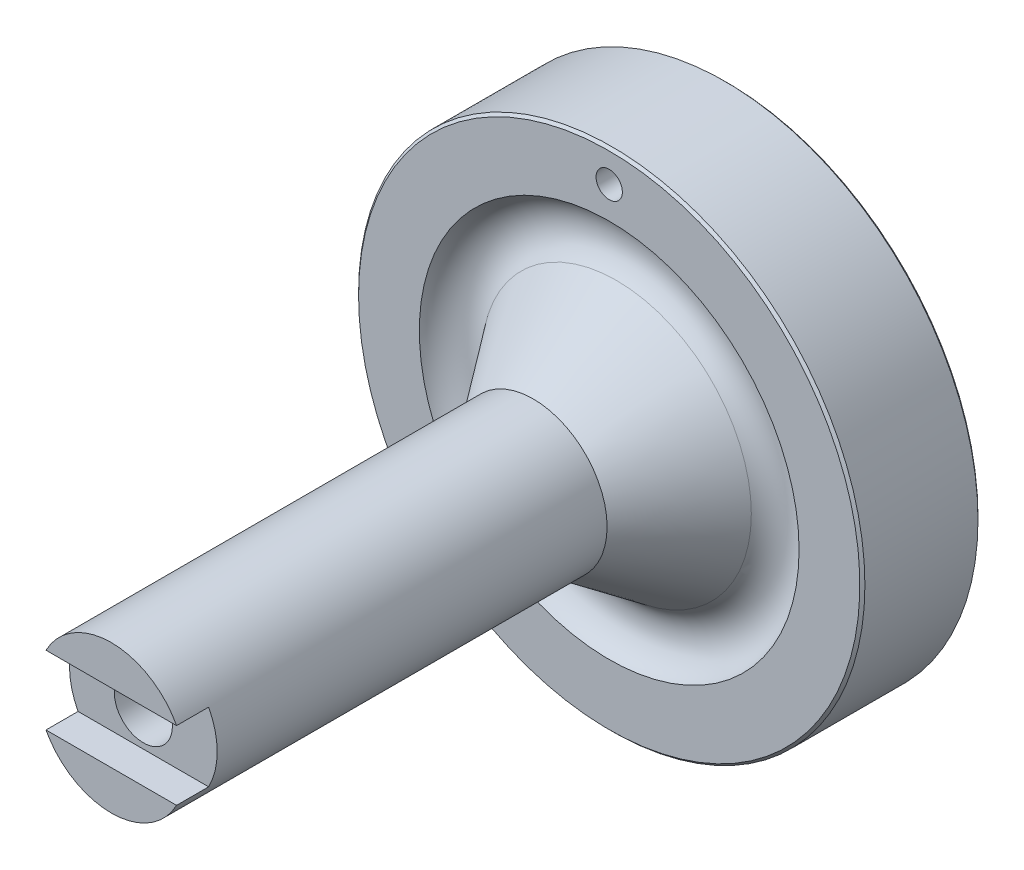
ISO-10303-21;
HEADER;
FILE_DESCRIPTION(('STEP AP214'),'2;1');
FILE_NAME('part.step','',(''),(''),'','','');
FILE_SCHEMA(('AUTOMOTIVE_DESIGN { 1 0 10303 214 1 1 1 1 }'));
ENDSEC;
DATA;
#1=APPLICATION_CONTEXT('core data for automotive mechanical design processes');
#2=APPLICATION_PROTOCOL_DEFINITION('international standard','automotive_design',2000,#1);
#3=PRODUCT_CONTEXT('',#1,'mechanical');
#4=PRODUCT('Part','Part','',(#3));
#5=PRODUCT_RELATED_PRODUCT_CATEGORY('part','',(#4));
#6=PRODUCT_DEFINITION_FORMATION('','',#4);
#7=PRODUCT_DEFINITION_CONTEXT('part definition',#1,'design');
#8=PRODUCT_DEFINITION('design','',#6,#7);
#9=PRODUCT_DEFINITION_SHAPE('','',#8);
#10=(LENGTH_UNIT() NAMED_UNIT(*) SI_UNIT(.MILLI.,.METRE.));
#11=(NAMED_UNIT(*) PLANE_ANGLE_UNIT() SI_UNIT($,.RADIAN.));
#12=(NAMED_UNIT(*) SI_UNIT($,.STERADIAN.) SOLID_ANGLE_UNIT());
#13=UNCERTAINTY_MEASURE_WITH_UNIT(LENGTH_MEASURE(1.E-05),#10,'distance_accuracy_value','');
#14=(GEOMETRIC_REPRESENTATION_CONTEXT(3) GLOBAL_UNCERTAINTY_ASSIGNED_CONTEXT((#13)) GLOBAL_UNIT_ASSIGNED_CONTEXT((#10,
#11,#12)) REPRESENTATION_CONTEXT('',''));
#15=CARTESIAN_POINT('',(0.,0.,0.));
#16=DIRECTION('',(0.,0.,1.));
#17=DIRECTION('',(1.,0.,0.));
#18=AXIS2_PLACEMENT_3D('',#15,#16,#17);
#19=CARTESIAN_POINT('',(0.,8.7376,0.));
#20=DIRECTION('',(0.,0.,-1.));
#21=DIRECTION('',(-1.,0.,0.));
#22=AXIS2_PLACEMENT_3D('',#19,#20,#21);
#23=PLANE('',#22);
#24=CARTESIAN_POINT('',(0.,0.,0.));
#25=DIRECTION('',(0.,0.,1.));
#26=DIRECTION('',(1.,0.,0.));
#27=AXIS2_PLACEMENT_3D('',#24,#25,#26);
#28=CIRCLE('',#27,22.225);
#29=CARTESIAN_POINT('',(19.6475854760833,10.3886,0.));
#30=VERTEX_POINT('',#29);
#31=CARTESIAN_POINT('',(-19.6475854760833,10.3886,0.));
#32=VERTEX_POINT('',#31);
#33=EDGE_CURVE('E166',#30,#32,#28,.T.);
#34=ORIENTED_EDGE('',*,*,#33,.T.);
#35=DIRECTION('',(1.,0.,0.));
#36=VECTOR('',#35,1.);
#37=CARTESIAN_POINT('',(-76.2,10.3886,0.));
#38=LINE('',#37,#36);
#39=EDGE_CURVE('E96',#32,#30,#38,.T.);
#40=ORIENTED_EDGE('',*,*,#39,.T.);
#41=EDGE_LOOP('',(#34,#40));
#42=FACE_BOUND('',#41,.T.);
#43=ADVANCED_FACE('F47',(#42),#23,.F.);
#44=CARTESIAN_POINT('',(0.,0.,0.));
#45=DIRECTION('',(0.,0.,1.));
#46=DIRECTION('',(1.,0.,0.));
#47=AXIS2_PLACEMENT_3D('',#44,#45,#46);
#48=CYLINDRICAL_SURFACE('',#47,22.225);
#49=ORIENTED_EDGE('',*,*,#33,.F.);
#50=DIRECTION('',(0.,0.,1.));
#51=VECTOR('',#50,1.);
#52=CARTESIAN_POINT('',(19.6475854760833,10.3886,0.));
#53=LINE('',#52,#51);
#54=CARTESIAN_POINT('',(19.6475854760833,10.3886,-9.652));
#55=VERTEX_POINT('',#54);
#56=EDGE_CURVE('E74',#30,#55,#53,.F.);
#57=ORIENTED_EDGE('',*,*,#56,.T.);
#58=CARTESIAN_POINT('',(0.,0.,-9.652));
#59=DIRECTION('',(0.,0.,-1.));
#60=DIRECTION('',(0.,1.,0.));
#61=AXIS2_PLACEMENT_3D('',#58,#59,#60);
#62=CIRCLE('',#61,22.225);
#63=CARTESIAN_POINT('',(19.6475854760833,-10.3886,-9.652));
#64=VERTEX_POINT('',#63);
#65=EDGE_CURVE('E109',#55,#64,#62,.T.);
#66=ORIENTED_EDGE('',*,*,#65,.T.);
#67=DIRECTION('',(0.,0.,1.));
#68=VECTOR('',#67,1.);
#69=CARTESIAN_POINT('',(19.6475854760833,-10.3886,0.));
#70=LINE('',#69,#68);
#71=CARTESIAN_POINT('',(19.6475854760833,-10.3886,0.));
#72=VERTEX_POINT('',#71);
#73=EDGE_CURVE('E128',#64,#72,#70,.T.);
#74=ORIENTED_EDGE('',*,*,#73,.T.);
#75=CARTESIAN_POINT('',(-19.6475854760833,-10.3886,0.));
#76=VERTEX_POINT('',#75);
#77=EDGE_CURVE('E165',#76,#72,#28,.T.);
#78=ORIENTED_EDGE('',*,*,#77,.F.);
#79=DIRECTION('',(0.,0.,1.));
#80=VECTOR('',#79,1.);
#81=CARTESIAN_POINT('',(-19.6475854760833,-10.3886,0.));
#82=LINE('',#81,#80);
#83=CARTESIAN_POINT('',(-19.6475854760833,-10.3886,-9.652));
#84=VERTEX_POINT('',#83);
#85=EDGE_CURVE('E66',#76,#84,#82,.F.);
#86=ORIENTED_EDGE('',*,*,#85,.T.);
#87=CARTESIAN_POINT('',(-19.6475854760833,10.3886,-9.652));
#88=VERTEX_POINT('',#87);
#89=EDGE_CURVE('E107',#84,#88,#62,.T.);
#90=ORIENTED_EDGE('',*,*,#89,.T.);
#91=DIRECTION('',(0.,0.,1.));
#92=VECTOR('',#91,1.);
#93=CARTESIAN_POINT('',(-19.6475854760833,10.3886,0.));
#94=LINE('',#93,#92);
#95=EDGE_CURVE('E92',#88,#32,#94,.T.);
#96=ORIENTED_EDGE('',*,*,#95,.T.);
#97=EDGE_LOOP('',(#49,#57,#66,#74,#78,#86,#90,#96));
#98=FACE_BOUND('',#97,.T.);
#99=CARTESIAN_POINT('',(0.,0.,-127.));
#100=DIRECTION('',(0.,0.,1.));
#101=DIRECTION('',(1.,0.,0.));
#102=AXIS2_PLACEMENT_3D('',#99,#100,#101);
#103=CIRCLE('',#102,22.225);
#104=CARTESIAN_POINT('',(22.225,0.,-127.));
#105=VERTEX_POINT('',#104);
#106=EDGE_CURVE('E102',#105,#105,#103,.T.);
#107=ORIENTED_EDGE('',*,*,#106,.T.);
#108=EDGE_LOOP('',(#107));
#109=FACE_BOUND('',#108,.T.);
#110=ADVANCED_FACE('F113',(#98,#109),#48,.T.);
#111=ORIENTED_EDGE('',*,*,#77,.T.);
#112=DIRECTION('',(1.,0.,0.));
#113=VECTOR('',#112,1.);
#114=CARTESIAN_POINT('',(-76.2,-10.3886,0.));
#115=LINE('',#114,#113);
#116=EDGE_CURVE('E124',#76,#72,#115,.T.);
#117=ORIENTED_EDGE('',*,*,#116,.F.);
#118=EDGE_LOOP('',(#111,#117));
#119=FACE_BOUND('',#118,.T.);
#120=ADVANCED_FACE('F221',(#119),#23,.F.);
#121=CARTESIAN_POINT('',(0.,0.,0.));
#122=DIRECTION('',(0.,0.,1.));
#123=DIRECTION('',(1.,0.,0.));
#124=AXIS2_PLACEMENT_3D('',#121,#122,#123);
#125=CYLINDRICAL_SURFACE('',#124,8.7376);
#126=CARTESIAN_POINT('',(0.,0.,-9.652));
#127=DIRECTION('',(0.,0.,-1.));
#128=DIRECTION('',(0.,1.,0.));
#129=AXIS2_PLACEMENT_3D('',#126,#127,#128);
#130=CIRCLE('',#129,8.7376);
#131=CARTESIAN_POINT('',(0.,8.7376,-9.652));
#132=VERTEX_POINT('',#131);
#133=EDGE_CURVE('E117',#132,#132,#130,.F.);
#134=ORIENTED_EDGE('',*,*,#133,.T.);
#135=EDGE_LOOP('',(#134));
#136=FACE_BOUND('',#135,.T.);
#137=CARTESIAN_POINT('',(0.,0.,-177.4952));
#138=DIRECTION('',(0.,0.,1.));
#139=DIRECTION('',(1.,0.,0.));
#140=AXIS2_PLACEMENT_3D('',#137,#138,#139);
#141=CIRCLE('',#140,8.7376);
#142=CARTESIAN_POINT('',(8.7376,0.,-177.4952));
#143=VERTEX_POINT('',#142);
#144=EDGE_CURVE('E161',#143,#143,#141,.T.);
#145=ORIENTED_EDGE('',*,*,#144,.F.);
#146=EDGE_LOOP('',(#145));
#147=FACE_BOUND('',#146,.T.);
#148=ADVANCED_FACE('F228',(#136,#147),#125,.F.);
#149=CARTESIAN_POINT('',(0.,15.875,-177.4952));
#150=DIRECTION('',(0.,0.,1.));
#151=DIRECTION('',(1.,0.,0.));
#152=AXIS2_PLACEMENT_3D('',#149,#150,#151);
#153=PLANE('',#152);
#154=CARTESIAN_POINT('',(0.,0.,-177.4952));
#155=DIRECTION('',(0.,0.,1.));
#156=DIRECTION('',(1.,0.,0.));
#157=AXIS2_PLACEMENT_3D('',#154,#155,#156);
#158=CIRCLE('',#157,15.875);
#159=CARTESIAN_POINT('',(15.875,0.,-177.4952));
#160=VERTEX_POINT('',#159);
#161=EDGE_CURVE('E157',#160,#160,#158,.T.);
#162=ORIENTED_EDGE('',*,*,#161,.F.);
#163=EDGE_LOOP('',(#162));
#164=FACE_BOUND('',#163,.T.);
#165=ORIENTED_EDGE('',*,*,#144,.T.);
#166=EDGE_LOOP('',(#165));
#167=FACE_BOUND('',#166,.T.);
#168=ADVANCED_FACE('F233',(#164,#167),#153,.F.);
#169=CARTESIAN_POINT('',(0.,0.,-177.4952));
#170=DIRECTION('',(0.,0.,1.));
#171=DIRECTION('',(1.,0.,0.));
#172=AXIS2_PLACEMENT_3D('',#169,#170,#171);
#173=CONICAL_SURFACE('',#172,15.875,0.785398163397444);
#174=CARTESIAN_POINT('',(0.,0.,-164.877524819936));
#175=DIRECTION('',(0.,0.,1.));
#176=DIRECTION('',(1.,0.,0.));
#177=AXIS2_PLACEMENT_3D('',#174,#175,#176);
#178=CIRCLE('',#177,28.4926751800638);
#179=CARTESIAN_POINT('',(28.4926751800638,0.,-164.877524819936));
#180=VERTEX_POINT('',#179);
#181=EDGE_CURVE('E153',#180,#180,#178,.T.);
#182=ORIENTED_EDGE('',*,*,#181,.F.);
#183=EDGE_LOOP('',(#182));
#184=FACE_BOUND('',#183,.T.);
#185=ORIENTED_EDGE('',*,*,#161,.T.);
#186=EDGE_LOOP('',(#185));
#187=FACE_BOUND('',#186,.T.);
#188=ADVANCED_FACE('F415',(#184,#187),#173,.T.);
#189=CARTESIAN_POINT('',(0.,0.,-171.612716910738));
#190=DIRECTION('',(0.,0.,1.));
#191=DIRECTION('',(1.,0.,0.));
#192=AXIS2_PLACEMENT_3D('',#189,#190,#191);
#193=TOROIDAL_SURFACE('',#192,35.2278672708657,9.52499999999998);
#194=CARTESIAN_POINT('',(0.,0.,-165.983806542921));
#195=DIRECTION('',(0.,0.,1.));
#196=DIRECTION('',(1.,0.,0.));
#197=AXIS2_PLACEMENT_3D('',#194,#195,#196);
#198=CIRCLE('',#197,42.9116809770326);
#199=CARTESIAN_POINT('',(42.9116809770326,0.,-165.983806542921));
#200=VERTEX_POINT('',#199);
#201=EDGE_CURVE('E149',#200,#200,#198,.T.);
#202=ORIENTED_EDGE('',*,*,#201,.F.);
#203=EDGE_LOOP('',(#202));
#204=FACE_BOUND('',#203,.T.);
#205=ORIENTED_EDGE('',*,*,#181,.T.);
#206=EDGE_LOOP('',(#205));
#207=FACE_BOUND('',#206,.T.);
#208=ADVANCED_FACE('F404',(#204,#207),#193,.F.);
#209=CARTESIAN_POINT('',(0.,0.,-165.983806542921));
#210=DIRECTION('',(0.,0.,-1.));
#211=DIRECTION('',(-1.,0.,0.));
#212=AXIS2_PLACEMENT_3D('',#209,#210,#211);
#213=CONICAL_SURFACE('',#212,42.9116809770326,0.632250485157045);
#214=CARTESIAN_POINT('',(0.,0.,-185.42));
#215=DIRECTION('',(0.,0.,1.));
#216=DIRECTION('',(1.,0.,0.));
#217=AXIS2_PLACEMENT_3D('',#214,#215,#216);
#218=CIRCLE('',#217,57.15);
#219=CARTESIAN_POINT('',(57.15,0.,-185.42));
#220=VERTEX_POINT('',#219);
#221=EDGE_CURVE('E145',#220,#220,#218,.T.);
#222=ORIENTED_EDGE('',*,*,#221,.F.);
#223=EDGE_LOOP('',(#222));
#224=FACE_BOUND('',#223,.T.);
#225=ORIENTED_EDGE('',*,*,#201,.T.);
#226=EDGE_LOOP('',(#225));
#227=FACE_BOUND('',#226,.T.);
#228=ADVANCED_FACE('F305',(#224,#227),#213,.F.);
#229=CARTESIAN_POINT('',(0.,76.2,-185.42));
#230=DIRECTION('',(0.,0.,1.));
#231=DIRECTION('',(1.,0.,0.));
#232=AXIS2_PLACEMENT_3D('',#229,#230,#231);
#233=PLANE('',#232);
#234=CARTESIAN_POINT('',(0.,66.675,-185.42));
#235=DIRECTION('',(0.,0.,-1.));
#236=DIRECTION('',(-1.,0.,0.));
#237=AXIS2_PLACEMENT_3D('',#234,#235,#236);
#238=CIRCLE('',#237,3.9624);
#239=CARTESIAN_POINT('',(-3.9624,66.675,-185.42));
#240=VERTEX_POINT('',#239);
#241=EDGE_CURVE('E243',#240,#240,#238,.T.);
#242=ORIENTED_EDGE('',*,*,#241,.F.);
#243=EDGE_LOOP('',(#242));
#244=FACE_BOUND('',#243,.T.);
#245=CARTESIAN_POINT('',(0.,0.,-185.42));
#246=DIRECTION('',(0.,0.,1.));
#247=DIRECTION('',(1.,0.,0.));
#248=AXIS2_PLACEMENT_3D('',#245,#246,#247);
#249=CIRCLE('',#248,75.4380000000001);
#250=CARTESIAN_POINT('',(75.4380000000001,0.,-185.42));
#251=VERTEX_POINT('',#250);
#252=EDGE_CURVE('E58',#251,#251,#249,.F.);
#253=ORIENTED_EDGE('',*,*,#252,.T.);
#254=EDGE_LOOP('',(#253));
#255=FACE_BOUND('',#254,.T.);
#256=ORIENTED_EDGE('',*,*,#221,.T.);
#257=EDGE_LOOP('',(#256));
#258=FACE_BOUND('',#257,.T.);
#259=ADVANCED_FACE('F181',(#244,#255,#258),#233,.F.);
#260=CARTESIAN_POINT('',(0.,0.,0.));
#261=DIRECTION('',(0.,0.,1.));
#262=DIRECTION('',(1.,0.,0.));
#263=AXIS2_PLACEMENT_3D('',#260,#261,#262);
#264=CYLINDRICAL_SURFACE('',#263,76.2);
#265=CARTESIAN_POINT('',(0.,0.,-184.658));
#266=DIRECTION('',(0.,0.,1.));
#267=DIRECTION('',(1.,0.,0.));
#268=AXIS2_PLACEMENT_3D('',#265,#266,#267);
#269=CIRCLE('',#268,76.2);
#270=CARTESIAN_POINT('',(76.2,0.,-184.658));
#271=VERTEX_POINT('',#270);
#272=EDGE_CURVE('E173',#271,#271,#269,.T.);
#273=ORIENTED_EDGE('',*,*,#272,.T.);
#274=EDGE_LOOP('',(#273));
#275=FACE_BOUND('',#274,.T.);
#276=CARTESIAN_POINT('',(0.,0.,-150.622));
#277=DIRECTION('',(0.,0.,-1.));
#278=DIRECTION('',(-1.,0.,0.));
#279=AXIS2_PLACEMENT_3D('',#276,#277,#278);
#280=CIRCLE('',#279,76.2);
#281=CARTESIAN_POINT('',(-76.2,0.,-150.622));
#282=VERTEX_POINT('',#281);
#283=EDGE_CURVE('E169',#282,#282,#280,.T.);
#284=ORIENTED_EDGE('',*,*,#283,.T.);
#285=EDGE_LOOP('',(#284));
#286=FACE_BOUND('',#285,.T.);
#287=ADVANCED_FACE('F190',(#275,#286),#264,.T.);
#288=CARTESIAN_POINT('',(0.,57.15,-149.86));
#289=DIRECTION('',(0.,0.,-1.));
#290=DIRECTION('',(-1.,0.,0.));
#291=AXIS2_PLACEMENT_3D('',#288,#289,#290);
#292=PLANE('',#291);
#293=CARTESIAN_POINT('',(0.,66.675,-149.86));
#294=DIRECTION('',(0.,0.,-1.));
#295=DIRECTION('',(-1.,0.,0.));
#296=AXIS2_PLACEMENT_3D('',#293,#294,#295);
#297=CIRCLE('',#296,3.9624);
#298=CARTESIAN_POINT('',(-3.9624,66.675,-149.86));
#299=VERTEX_POINT('',#298);
#300=EDGE_CURVE('E52',#299,#299,#297,.T.);
#301=ORIENTED_EDGE('',*,*,#300,.T.);
#302=EDGE_LOOP('',(#301));
#303=FACE_BOUND('',#302,.T.);
#304=CARTESIAN_POINT('',(0.,0.,-149.86));
#305=DIRECTION('',(0.,0.,-1.));
#306=DIRECTION('',(-1.,0.,0.));
#307=AXIS2_PLACEMENT_3D('',#304,#305,#306);
#308=CIRCLE('',#307,75.4379999999999);
#309=CARTESIAN_POINT('',(-75.4379999999999,0.,-149.86));
#310=VERTEX_POINT('',#309);
#311=EDGE_CURVE('E11',#310,#310,#308,.F.);
#312=ORIENTED_EDGE('',*,*,#311,.T.);
#313=EDGE_LOOP('',(#312));
#314=FACE_BOUND('',#313,.T.);
#315=CARTESIAN_POINT('',(0.,0.,-149.86));
#316=DIRECTION('',(0.,0.,1.));
#317=DIRECTION('',(1.,0.,0.));
#318=AXIS2_PLACEMENT_3D('',#315,#316,#317);
#319=CIRCLE('',#318,57.15);
#320=CARTESIAN_POINT('',(57.15,0.,-149.86));
#321=VERTEX_POINT('',#320);
#322=EDGE_CURVE('E141',#321,#321,#319,.T.);
#323=ORIENTED_EDGE('',*,*,#322,.F.);
#324=EDGE_LOOP('',(#323));
#325=FACE_BOUND('',#324,.T.);
#326=ADVANCED_FACE('F193',(#303,#314,#325),#292,.F.);
#327=CARTESIAN_POINT('',(0.,0.,-146.428090794783));
#328=DIRECTION('',(0.,0.,1.));
#329=DIRECTION('',(1.,0.,0.));
#330=AXIS2_PLACEMENT_3D('',#327,#328,#329);
#331=TOROIDAL_SURFACE('',#330,48.2647524397376,9.525);
#332=CARTESIAN_POINT('',(0.,0.,-152.057001162601));
#333=DIRECTION('',(0.,0.,1.));
#334=DIRECTION('',(1.,0.,0.));
#335=AXIS2_PLACEMENT_3D('',#332,#333,#334);
#336=CIRCLE('',#335,40.5809387335706);
#337=CARTESIAN_POINT('',(40.5809387335706,0.,-152.057001162601));
#338=VERTEX_POINT('',#337);
#339=EDGE_CURVE('E137',#338,#338,#336,.T.);
#340=ORIENTED_EDGE('',*,*,#339,.F.);
#341=EDGE_LOOP('',(#340));
#342=FACE_BOUND('',#341,.T.);
#343=ORIENTED_EDGE('',*,*,#322,.T.);
#344=EDGE_LOOP('',(#343));
#345=FACE_BOUND('',#344,.T.);
#346=ADVANCED_FACE('F203',(#342,#345),#331,.F.);
#347=CARTESIAN_POINT('',(0.,0.,-152.057001162601));
#348=DIRECTION('',(0.,0.,-1.));
#349=DIRECTION('',(-1.,0.,0.));
#350=AXIS2_PLACEMENT_3D('',#347,#348,#349);
#351=CONICAL_SURFACE('',#350,40.5809387335706,0.632250485157046);
#352=ORIENTED_EDGE('',*,*,#106,.F.);
#353=EDGE_LOOP('',(#352));
#354=FACE_BOUND('',#353,.T.);
#355=ORIENTED_EDGE('',*,*,#339,.T.);
#356=EDGE_LOOP('',(#355));
#357=FACE_BOUND('',#356,.T.);
#358=ADVANCED_FACE('F187',(#354,#357),#351,.T.);
#359=CARTESIAN_POINT('',(0.,0.,-184.658));
#360=DIRECTION('',(0.,0.,1.));
#361=DIRECTION('',(1.,0.,0.));
#362=AXIS2_PLACEMENT_3D('',#359,#360,#361);
#363=CONICAL_SURFACE('',#362,76.2,0.785398163397448);
#364=ORIENTED_EDGE('',*,*,#252,.F.);
#365=EDGE_LOOP('',(#364));
#366=FACE_BOUND('',#365,.T.);
#367=ORIENTED_EDGE('',*,*,#272,.F.);
#368=EDGE_LOOP('',(#367));
#369=FACE_BOUND('',#368,.T.);
#370=ADVANCED_FACE('F184',(#366,#369),#363,.T.);
#371=CARTESIAN_POINT('',(0.,0.,-149.86));
#372=DIRECTION('',(0.,0.,-1.));
#373=DIRECTION('',(-1.,0.,0.));
#374=AXIS2_PLACEMENT_3D('',#371,#372,#373);
#375=CONICAL_SURFACE('',#374,75.4379999999999,0.785398163397448);
#376=ORIENTED_EDGE('',*,*,#283,.F.);
#377=EDGE_LOOP('',(#376));
#378=FACE_BOUND('',#377,.T.);
#379=ORIENTED_EDGE('',*,*,#311,.F.);
#380=EDGE_LOOP('',(#379));
#381=FACE_BOUND('',#380,.T.);
#382=ADVANCED_FACE('F50',(#378,#381),#375,.T.);
#383=CARTESIAN_POINT('',(-76.2,10.3886,-9.652));
#384=DIRECTION('',(0.,1.,0.));
#385=DIRECTION('',(0.,0.,1.));
#386=AXIS2_PLACEMENT_3D('',#383,#384,#385);
#387=PLANE('',#386);
#388=DIRECTION('',(1.,0.,0.));
#389=VECTOR('',#388,1.);
#390=CARTESIAN_POINT('',(-76.2,10.3886,-9.652));
#391=LINE('',#390,#389);
#392=EDGE_CURVE('E95',#88,#55,#391,.T.);
#393=ORIENTED_EDGE('',*,*,#392,.T.);
#394=ORIENTED_EDGE('',*,*,#56,.F.);
#395=ORIENTED_EDGE('',*,*,#39,.F.);
#396=ORIENTED_EDGE('',*,*,#95,.F.);
#397=EDGE_LOOP('',(#393,#394,#395,#396));
#398=FACE_BOUND('',#397,.T.);
#399=ADVANCED_FACE('F94',(#398),#387,.F.);
#400=CARTESIAN_POINT('',(-76.2,-10.3886,-9.652));
#401=DIRECTION('',(0.,-1.,0.));
#402=DIRECTION('',(0.,0.,-1.));
#403=AXIS2_PLACEMENT_3D('',#400,#401,#402);
#404=PLANE('',#403);
#405=DIRECTION('',(1.,0.,0.));
#406=VECTOR('',#405,1.);
#407=CARTESIAN_POINT('',(-76.2,-10.3886,-9.652));
#408=LINE('',#407,#406);
#409=EDGE_CURVE('E111',#84,#64,#408,.T.);
#410=ORIENTED_EDGE('',*,*,#409,.F.);
#411=ORIENTED_EDGE('',*,*,#85,.F.);
#412=ORIENTED_EDGE('',*,*,#116,.T.);
#413=ORIENTED_EDGE('',*,*,#73,.F.);
#414=EDGE_LOOP('',(#410,#411,#412,#413));
#415=FACE_BOUND('',#414,.T.);
#416=ADVANCED_FACE('F237',(#415),#404,.F.);
#417=CARTESIAN_POINT('',(-76.2,-10.3886,-9.652));
#418=DIRECTION('',(0.,0.,-1.));
#419=DIRECTION('',(0.,1.,0.));
#420=AXIS2_PLACEMENT_3D('',#417,#418,#419);
#421=PLANE('',#420);
#422=ORIENTED_EDGE('',*,*,#133,.F.);
#423=EDGE_LOOP('',(#422));
#424=FACE_BOUND('',#423,.T.);
#425=ORIENTED_EDGE('',*,*,#392,.F.);
#426=ORIENTED_EDGE('',*,*,#89,.F.);
#427=ORIENTED_EDGE('',*,*,#409,.T.);
#428=ORIENTED_EDGE('',*,*,#65,.F.);
#429=EDGE_LOOP('',(#425,#426,#427,#428));
#430=FACE_BOUND('',#429,.T.);
#431=ADVANCED_FACE('F105',(#424,#430),#421,.F.);
#432=CARTESIAN_POINT('',(0.,66.675,0.));
#433=DIRECTION('',(0.,0.,-1.));
#434=DIRECTION('',(-1.,0.,0.));
#435=AXIS2_PLACEMENT_3D('',#432,#433,#434);
#436=CYLINDRICAL_SURFACE('',#435,3.9624);
#437=ORIENTED_EDGE('',*,*,#241,.T.);
#438=EDGE_LOOP('',(#437));
#439=FACE_BOUND('',#438,.T.);
#440=ORIENTED_EDGE('',*,*,#300,.F.);
#441=EDGE_LOOP('',(#440));
#442=FACE_BOUND('',#441,.T.);
#443=ADVANCED_FACE('F252',(#439,#442),#436,.F.);
#444=CLOSED_SHELL('',(#43,#110,#120,#148,#168,#188,#208,#228,#259,#287,#326,#346,#358,#370,#382,
#399,#416,#431,#443));
#445=MANIFOLD_SOLID_BREP('B2',#444);
#446=ADVANCED_BREP_SHAPE_REPRESENTATION('',(#18,#445),#14);
#447=SHAPE_DEFINITION_REPRESENTATION(#9,#446);
ENDSEC;
END-ISO-10303-21;
